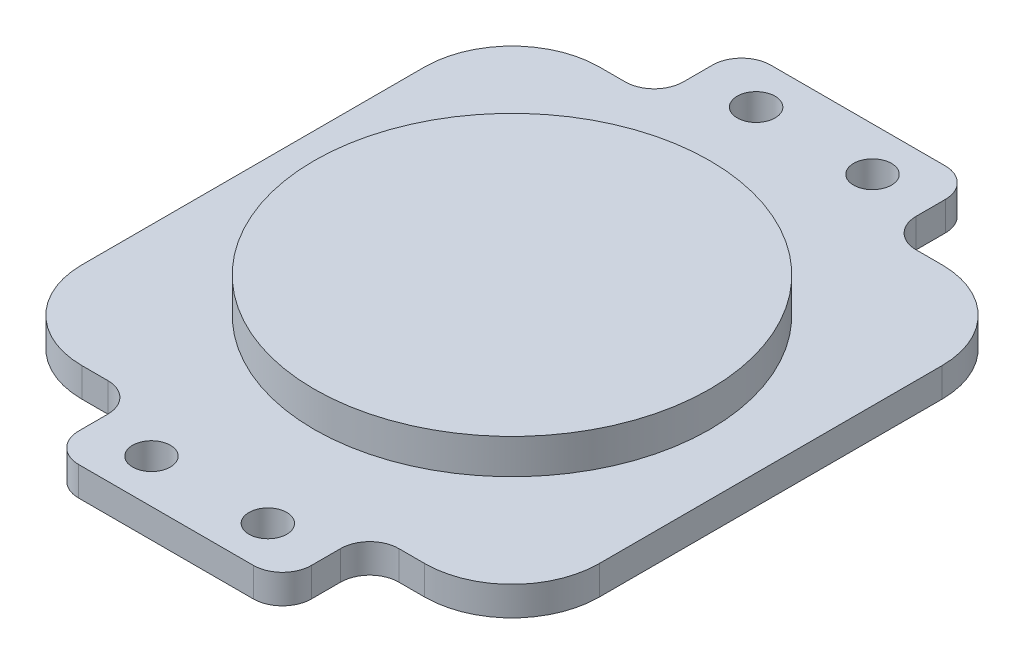
ISO-10303-21;
HEADER;
FILE_DESCRIPTION(('STEP AP214'),'2;1');
FILE_NAME('part.step','',(''),(''),'','','');
FILE_SCHEMA(('AUTOMOTIVE_DESIGN { 1 0 10303 214 1 1 1 1 }'));
ENDSEC;
DATA;
#1=APPLICATION_CONTEXT('core data for automotive mechanical design processes');
#2=APPLICATION_PROTOCOL_DEFINITION('international standard','automotive_design',2000,#1);
#3=PRODUCT_CONTEXT('',#1,'mechanical');
#4=PRODUCT('Part','Part','',(#3));
#5=PRODUCT_RELATED_PRODUCT_CATEGORY('part','',(#4));
#6=PRODUCT_DEFINITION_FORMATION('','',#4);
#7=PRODUCT_DEFINITION_CONTEXT('part definition',#1,'design');
#8=PRODUCT_DEFINITION('design','',#6,#7);
#9=PRODUCT_DEFINITION_SHAPE('','',#8);
#10=(LENGTH_UNIT() NAMED_UNIT(*) SI_UNIT(.MILLI.,.METRE.));
#11=(NAMED_UNIT(*) PLANE_ANGLE_UNIT() SI_UNIT($,.RADIAN.));
#12=(NAMED_UNIT(*) SI_UNIT($,.STERADIAN.) SOLID_ANGLE_UNIT());
#13=UNCERTAINTY_MEASURE_WITH_UNIT(LENGTH_MEASURE(1.E-05),#10,'distance_accuracy_value','');
#14=(GEOMETRIC_REPRESENTATION_CONTEXT(3) GLOBAL_UNCERTAINTY_ASSIGNED_CONTEXT((#13)) GLOBAL_UNIT_ASSIGNED_CONTEXT((#10,
#11,#12)) REPRESENTATION_CONTEXT('',''));
#15=CARTESIAN_POINT('',(0.,0.,0.));
#16=DIRECTION('',(0.,0.,1.));
#17=DIRECTION('',(1.,0.,0.));
#18=AXIS2_PLACEMENT_3D('',#15,#16,#17);
#19=CARTESIAN_POINT('',(-44.45,5.,-44.45));
#20=DIRECTION('',(0.,0.,1.));
#21=DIRECTION('',(1.,0.,0.));
#22=AXIS2_PLACEMENT_3D('',#19,#20,#21);
#23=PLANE('',#22);
#24=DIRECTION('',(-1.,0.,0.));
#25=VECTOR('',#24,1.);
#26=CARTESIAN_POINT('',(-44.45,0.,-44.45));
#27=LINE('',#26,#25);
#28=CARTESIAN_POINT('',(29.45,0.,-44.45));
#29=VERTEX_POINT('',#28);
#30=CARTESIAN_POINT('',(25.,0.,-44.45));
#31=VERTEX_POINT('',#30);
#32=EDGE_CURVE('E425',#29,#31,#27,.T.);
#33=ORIENTED_EDGE('',*,*,#32,.T.);
#34=DIRECTION('',(0.,-1.,0.));
#35=VECTOR('',#34,1.);
#36=CARTESIAN_POINT('',(25.,5.,-44.45));
#37=LINE('',#36,#35);
#38=CARTESIAN_POINT('',(25.,5.,-44.45));
#39=VERTEX_POINT('',#38);
#40=EDGE_CURVE('E297',#31,#39,#37,.F.);
#41=ORIENTED_EDGE('',*,*,#40,.T.);
#42=DIRECTION('',(-1.,0.,0.));
#43=VECTOR('',#42,1.);
#44=CARTESIAN_POINT('',(-44.45,5.,-44.45));
#45=LINE('',#44,#43);
#46=CARTESIAN_POINT('',(29.45,5.,-44.45));
#47=VERTEX_POINT('',#46);
#48=EDGE_CURVE('E415',#47,#39,#45,.T.);
#49=ORIENTED_EDGE('',*,*,#48,.F.);
#50=DIRECTION('',(0.,-1.,0.));
#51=VECTOR('',#50,1.);
#52=CARTESIAN_POINT('',(29.45,5.,-44.45));
#53=LINE('',#52,#51);
#54=EDGE_CURVE('E282',#47,#29,#53,.T.);
#55=ORIENTED_EDGE('',*,*,#54,.T.);
#56=EDGE_LOOP('',(#33,#41,#49,#55));
#57=FACE_BOUND('',#56,.T.);
#58=ADVANCED_FACE('F44',(#57),#23,.F.);
#59=CARTESIAN_POINT('',(-44.45,5.,44.45));
#60=DIRECTION('',(0.,0.,-1.));
#61=DIRECTION('',(-1.,0.,0.));
#62=AXIS2_PLACEMENT_3D('',#59,#60,#61);
#63=PLANE('',#62);
#64=DIRECTION('',(1.,0.,0.));
#65=VECTOR('',#64,1.);
#66=CARTESIAN_POINT('',(-44.45,0.,44.45));
#67=LINE('',#66,#65);
#68=CARTESIAN_POINT('',(-29.45,0.,44.45));
#69=VERTEX_POINT('',#68);
#70=CARTESIAN_POINT('',(-25.,0.,44.45));
#71=VERTEX_POINT('',#70);
#72=EDGE_CURVE('E246',#69,#71,#67,.T.);
#73=ORIENTED_EDGE('',*,*,#72,.T.);
#74=DIRECTION('',(0.,-1.,0.));
#75=VECTOR('',#74,1.);
#76=CARTESIAN_POINT('',(-25.,5.,44.45));
#77=LINE('',#76,#75);
#78=CARTESIAN_POINT('',(-25.,5.,44.45));
#79=VERTEX_POINT('',#78);
#80=EDGE_CURVE('E228',#71,#79,#77,.F.);
#81=ORIENTED_EDGE('',*,*,#80,.T.);
#82=DIRECTION('',(1.,0.,0.));
#83=VECTOR('',#82,1.);
#84=CARTESIAN_POINT('',(-44.45,5.,44.45));
#85=LINE('',#84,#83);
#86=CARTESIAN_POINT('',(-29.45,5.,44.45));
#87=VERTEX_POINT('',#86);
#88=EDGE_CURVE('E210',#87,#79,#85,.T.);
#89=ORIENTED_EDGE('',*,*,#88,.F.);
#90=DIRECTION('',(0.,-1.,0.));
#91=VECTOR('',#90,1.);
#92=CARTESIAN_POINT('',(-29.45,5.,44.45));
#93=LINE('',#92,#91);
#94=EDGE_CURVE('E225',#87,#69,#93,.T.);
#95=ORIENTED_EDGE('',*,*,#94,.T.);
#96=EDGE_LOOP('',(#73,#81,#89,#95));
#97=FACE_BOUND('',#96,.T.);
#98=ADVANCED_FACE('F224',(#97),#63,.F.);
#99=CARTESIAN_POINT('',(44.45,5.,44.45));
#100=DIRECTION('',(-1.,0.,0.));
#101=DIRECTION('',(0.,0.,1.));
#102=AXIS2_PLACEMENT_3D('',#99,#100,#101);
#103=PLANE('',#102);
#104=DIRECTION('',(0.,0.,-1.));
#105=VECTOR('',#104,1.);
#106=CARTESIAN_POINT('',(44.45,5.,44.45));
#107=LINE('',#106,#105);
#108=CARTESIAN_POINT('',(44.45,5.,29.45));
#109=VERTEX_POINT('',#108);
#110=CARTESIAN_POINT('',(44.45,5.,-29.45));
#111=VERTEX_POINT('',#110);
#112=EDGE_CURVE('E435',#109,#111,#107,.T.);
#113=ORIENTED_EDGE('',*,*,#112,.F.);
#114=DIRECTION('',(0.,-1.,0.));
#115=VECTOR('',#114,1.);
#116=CARTESIAN_POINT('',(44.45,5.,29.45));
#117=LINE('',#116,#115);
#118=CARTESIAN_POINT('',(44.45,0.,29.45));
#119=VERTEX_POINT('',#118);
#120=EDGE_CURVE('E274',#109,#119,#117,.T.);
#121=ORIENTED_EDGE('',*,*,#120,.T.);
#122=DIRECTION('',(0.,0.,-1.));
#123=VECTOR('',#122,1.);
#124=CARTESIAN_POINT('',(44.45,0.,44.45));
#125=LINE('',#124,#123);
#126=CARTESIAN_POINT('',(44.45,0.,-29.45));
#127=VERTEX_POINT('',#126);
#128=EDGE_CURVE('E419',#119,#127,#125,.T.);
#129=ORIENTED_EDGE('',*,*,#128,.T.);
#130=DIRECTION('',(0.,-1.,0.));
#131=VECTOR('',#130,1.);
#132=CARTESIAN_POINT('',(44.45,5.,-29.45));
#133=LINE('',#132,#131);
#134=EDGE_CURVE('E218',#127,#111,#133,.F.);
#135=ORIENTED_EDGE('',*,*,#134,.T.);
#136=EDGE_LOOP('',(#113,#121,#129,#135));
#137=FACE_BOUND('',#136,.T.);
#138=ADVANCED_FACE('F536',(#137),#103,.F.);
#139=CARTESIAN_POINT('',(-25.,5.,-44.45));
#140=VERTEX_POINT('',#139);
#141=CARTESIAN_POINT('',(-29.45,5.,-44.45));
#142=VERTEX_POINT('',#141);
#143=EDGE_CURVE('E438',#140,#142,#45,.T.);
#144=ORIENTED_EDGE('',*,*,#143,.F.);
#145=DIRECTION('',(0.,-1.,0.));
#146=VECTOR('',#145,1.);
#147=CARTESIAN_POINT('',(-25.,5.,-44.45));
#148=LINE('',#147,#146);
#149=CARTESIAN_POINT('',(-25.,0.,-44.45));
#150=VERTEX_POINT('',#149);
#151=EDGE_CURVE('E337',#140,#150,#148,.T.);
#152=ORIENTED_EDGE('',*,*,#151,.T.);
#153=CARTESIAN_POINT('',(-29.45,0.,-44.45));
#154=VERTEX_POINT('',#153);
#155=EDGE_CURVE('E423',#150,#154,#27,.T.);
#156=ORIENTED_EDGE('',*,*,#155,.T.);
#157=DIRECTION('',(0.,-1.,0.));
#158=VECTOR('',#157,1.);
#159=CARTESIAN_POINT('',(-29.45,5.,-44.45));
#160=LINE('',#159,#158);
#161=EDGE_CURVE('E286',#154,#142,#160,.F.);
#162=ORIENTED_EDGE('',*,*,#161,.T.);
#163=EDGE_LOOP('',(#144,#152,#156,#162));
#164=FACE_BOUND('',#163,.T.);
#165=ADVANCED_FACE('F531',(#164),#23,.F.);
#166=CARTESIAN_POINT('',(-44.45,5.,44.45));
#167=DIRECTION('',(1.,0.,0.));
#168=DIRECTION('',(0.,0.,-1.));
#169=AXIS2_PLACEMENT_3D('',#166,#167,#168);
#170=PLANE('',#169);
#171=DIRECTION('',(0.,0.,1.));
#172=VECTOR('',#171,1.);
#173=CARTESIAN_POINT('',(-44.45,0.,44.45));
#174=LINE('',#173,#172);
#175=CARTESIAN_POINT('',(-44.45,0.,-29.45));
#176=VERTEX_POINT('',#175);
#177=CARTESIAN_POINT('',(-44.45,0.,29.45));
#178=VERTEX_POINT('',#177);
#179=EDGE_CURVE('E428',#176,#178,#174,.T.);
#180=ORIENTED_EDGE('',*,*,#179,.T.);
#181=DIRECTION('',(0.,-1.,0.));
#182=VECTOR('',#181,1.);
#183=CARTESIAN_POINT('',(-44.45,5.,29.45));
#184=LINE('',#183,#182);
#185=CARTESIAN_POINT('',(-44.45,5.,29.45));
#186=VERTEX_POINT('',#185);
#187=EDGE_CURVE('E261',#178,#186,#184,.F.);
#188=ORIENTED_EDGE('',*,*,#187,.T.);
#189=DIRECTION('',(0.,0.,1.));
#190=VECTOR('',#189,1.);
#191=CARTESIAN_POINT('',(-44.45,5.,44.45));
#192=LINE('',#191,#190);
#193=CARTESIAN_POINT('',(-44.45,5.,-29.45));
#194=VERTEX_POINT('',#193);
#195=EDGE_CURVE('E213',#194,#186,#192,.T.);
#196=ORIENTED_EDGE('',*,*,#195,.F.);
#197=DIRECTION('',(0.,-1.,0.));
#198=VECTOR('',#197,1.);
#199=CARTESIAN_POINT('',(-44.45,5.,-29.45));
#200=LINE('',#199,#198);
#201=EDGE_CURVE('E257',#194,#176,#200,.T.);
#202=ORIENTED_EDGE('',*,*,#201,.T.);
#203=EDGE_LOOP('',(#180,#188,#196,#202));
#204=FACE_BOUND('',#203,.T.);
#205=ADVANCED_FACE('F541',(#204),#170,.F.);
#206=CARTESIAN_POINT('',(25.,5.,44.45));
#207=VERTEX_POINT('',#206);
#208=CARTESIAN_POINT('',(29.45,5.,44.45));
#209=VERTEX_POINT('',#208);
#210=EDGE_CURVE('E231',#207,#209,#85,.T.);
#211=ORIENTED_EDGE('',*,*,#210,.F.);
#212=DIRECTION('',(0.,-1.,0.));
#213=VECTOR('',#212,1.);
#214=CARTESIAN_POINT('',(25.,5.,44.45));
#215=LINE('',#214,#213);
#216=CARTESIAN_POINT('',(25.,0.,44.45));
#217=VERTEX_POINT('',#216);
#218=EDGE_CURVE('E350',#207,#217,#215,.T.);
#219=ORIENTED_EDGE('',*,*,#218,.T.);
#220=CARTESIAN_POINT('',(29.45,0.,44.45));
#221=VERTEX_POINT('',#220);
#222=EDGE_CURVE('E392',#217,#221,#67,.T.);
#223=ORIENTED_EDGE('',*,*,#222,.T.);
#224=DIRECTION('',(0.,-1.,0.));
#225=VECTOR('',#224,1.);
#226=CARTESIAN_POINT('',(29.45,5.,44.45));
#227=LINE('',#226,#225);
#228=EDGE_CURVE('E278',#221,#209,#227,.F.);
#229=ORIENTED_EDGE('',*,*,#228,.T.);
#230=EDGE_LOOP('',(#211,#219,#223,#229));
#231=FACE_BOUND('',#230,.T.);
#232=ADVANCED_FACE('F410',(#231),#63,.F.);
#233=CARTESIAN_POINT('',(0.,5.,0.));
#234=DIRECTION('',(0.,-1.,0.));
#235=DIRECTION('',(0.,0.,-1.));
#236=AXIS2_PLACEMENT_3D('',#233,#234,#235);
#237=PLANE('',#236);
#238=CARTESIAN_POINT('',(-10.,5.,51.95));
#239=DIRECTION('',(0.,-1.,0.));
#240=DIRECTION('',(0.,0.,-1.));
#241=AXIS2_PLACEMENT_3D('',#238,#239,#240);
#242=CIRCLE('',#241,3.25);
#243=CARTESIAN_POINT('',(-10.,5.,48.7));
#244=VERTEX_POINT('',#243);
#245=EDGE_CURVE('E797',#244,#244,#242,.T.);
#246=ORIENTED_EDGE('',*,*,#245,.T.);
#247=EDGE_LOOP('',(#246));
#248=FACE_BOUND('',#247,.T.);
#249=CARTESIAN_POINT('',(10.,5.,-51.95));
#250=DIRECTION('',(0.,-1.,0.));
#251=DIRECTION('',(0.,0.,-1.));
#252=AXIS2_PLACEMENT_3D('',#249,#250,#251);
#253=CIRCLE('',#252,3.25);
#254=CARTESIAN_POINT('',(10.,5.,-55.2));
#255=VERTEX_POINT('',#254);
#256=EDGE_CURVE('E788',#255,#255,#253,.T.);
#257=ORIENTED_EDGE('',*,*,#256,.T.);
#258=EDGE_LOOP('',(#257));
#259=FACE_BOUND('',#258,.T.);
#260=CARTESIAN_POINT('',(-10.,5.,-51.95));
#261=DIRECTION('',(0.,-1.,0.));
#262=DIRECTION('',(0.,0.,-1.));
#263=AXIS2_PLACEMENT_3D('',#260,#261,#262);
#264=CIRCLE('',#263,3.25);
#265=CARTESIAN_POINT('',(-10.,5.,-55.2));
#266=VERTEX_POINT('',#265);
#267=EDGE_CURVE('E804',#266,#266,#264,.T.);
#268=ORIENTED_EDGE('',*,*,#267,.T.);
#269=EDGE_LOOP('',(#268));
#270=FACE_BOUND('',#269,.T.);
#271=CARTESIAN_POINT('',(10.,5.,51.95));
#272=DIRECTION('',(0.,-1.,0.));
#273=DIRECTION('',(0.,0.,-1.));
#274=AXIS2_PLACEMENT_3D('',#271,#272,#273);
#275=CIRCLE('',#274,3.25);
#276=CARTESIAN_POINT('',(10.,5.,48.7));
#277=VERTEX_POINT('',#276);
#278=EDGE_CURVE('E465',#277,#277,#275,.T.);
#279=ORIENTED_EDGE('',*,*,#278,.T.);
#280=EDGE_LOOP('',(#279));
#281=FACE_BOUND('',#280,.T.);
#282=CARTESIAN_POINT('',(0.,5.,0.));
#283=DIRECTION('',(0.,1.,0.));
#284=DIRECTION('',(0.,0.,1.));
#285=AXIS2_PLACEMENT_3D('',#282,#283,#284);
#286=CIRCLE('',#285,34.);
#287=CARTESIAN_POINT('',(0.,5.,34.));
#288=VERTEX_POINT('',#287);
#289=EDGE_CURVE('E230',#288,#288,#286,.T.);
#290=ORIENTED_EDGE('',*,*,#289,.F.);
#291=EDGE_LOOP('',(#290));
#292=FACE_BOUND('',#291,.T.);
#293=DIRECTION('',(0.,0.,-1.));
#294=VECTOR('',#293,1.);
#295=CARTESIAN_POINT('',(20.,5.,0.));
#296=LINE('',#295,#294);
#297=CARTESIAN_POINT('',(20.,5.,-49.45));
#298=VERTEX_POINT('',#297);
#299=CARTESIAN_POINT('',(20.,5.,-54.45));
#300=VERTEX_POINT('',#299);
#301=EDGE_CURVE('E461',#298,#300,#296,.T.);
#302=ORIENTED_EDGE('',*,*,#301,.T.);
#303=CARTESIAN_POINT('',(15.,5.,-54.45));
#304=DIRECTION('',(0.,-1.,0.));
#305=DIRECTION('',(0.,0.,-1.));
#306=AXIS2_PLACEMENT_3D('',#303,#304,#305);
#307=CIRCLE('',#306,5.);
#308=CARTESIAN_POINT('',(15.,5.,-59.45));
#309=VERTEX_POINT('',#308);
#310=EDGE_CURVE('E327',#300,#309,#307,.F.);
#311=ORIENTED_EDGE('',*,*,#310,.T.);
#312=DIRECTION('',(1.,0.,0.));
#313=VECTOR('',#312,1.);
#314=CARTESIAN_POINT('',(0.,5.,-59.45));
#315=LINE('',#314,#313);
#316=CARTESIAN_POINT('',(-15.,5.,-59.45));
#317=VERTEX_POINT('',#316);
#318=EDGE_CURVE('E476',#317,#309,#315,.T.);
#319=ORIENTED_EDGE('',*,*,#318,.F.);
#320=CARTESIAN_POINT('',(-15.,5.,-54.45));
#321=DIRECTION('',(0.,-1.,0.));
#322=DIRECTION('',(0.,0.,-1.));
#323=AXIS2_PLACEMENT_3D('',#320,#321,#322);
#324=CIRCLE('',#323,5.);
#325=CARTESIAN_POINT('',(-20.,5.,-54.45));
#326=VERTEX_POINT('',#325);
#327=EDGE_CURVE('E66',#317,#326,#324,.F.);
#328=ORIENTED_EDGE('',*,*,#327,.T.);
#329=DIRECTION('',(0.,0.,-1.));
#330=VECTOR('',#329,1.);
#331=CARTESIAN_POINT('',(-20.,5.,0.));
#332=LINE('',#331,#330);
#333=CARTESIAN_POINT('',(-20.,5.,-49.45));
#334=VERTEX_POINT('',#333);
#335=EDGE_CURVE('E503',#334,#326,#332,.T.);
#336=ORIENTED_EDGE('',*,*,#335,.F.);
#337=CARTESIAN_POINT('',(-25.,5.,-49.45));
#338=DIRECTION('',(0.,-1.,0.));
#339=DIRECTION('',(0.,0.,-1.));
#340=AXIS2_PLACEMENT_3D('',#337,#338,#339);
#341=CIRCLE('',#340,5.);
#342=EDGE_CURVE('E60',#334,#140,#341,.T.);
#343=ORIENTED_EDGE('',*,*,#342,.T.);
#344=ORIENTED_EDGE('',*,*,#143,.T.);
#345=CARTESIAN_POINT('',(-29.45,5.,-29.45));
#346=DIRECTION('',(0.,-1.,0.));
#347=DIRECTION('',(0.,0.,-1.));
#348=AXIS2_PLACEMENT_3D('',#345,#346,#347);
#349=CIRCLE('',#348,15.);
#350=EDGE_CURVE('E264',#142,#194,#349,.F.);
#351=ORIENTED_EDGE('',*,*,#350,.T.);
#352=ORIENTED_EDGE('',*,*,#195,.T.);
#353=CARTESIAN_POINT('',(-29.45,5.,29.45));
#354=DIRECTION('',(0.,-1.,0.));
#355=DIRECTION('',(0.,0.,-1.));
#356=AXIS2_PLACEMENT_3D('',#353,#354,#355);
#357=CIRCLE('',#356,15.);
#358=EDGE_CURVE('E206',#186,#87,#357,.F.);
#359=ORIENTED_EDGE('',*,*,#358,.T.);
#360=ORIENTED_EDGE('',*,*,#88,.T.);
#361=CARTESIAN_POINT('',(-25.,5.,49.45));
#362=DIRECTION('',(0.,-1.,0.));
#363=DIRECTION('',(0.,0.,-1.));
#364=AXIS2_PLACEMENT_3D('',#361,#362,#363);
#365=CIRCLE('',#364,5.);
#366=CARTESIAN_POINT('',(-20.,5.,49.45));
#367=VERTEX_POINT('',#366);
#368=EDGE_CURVE('E382',#79,#367,#365,.T.);
#369=ORIENTED_EDGE('',*,*,#368,.T.);
#370=DIRECTION('',(0.,0.,1.));
#371=VECTOR('',#370,1.);
#372=CARTESIAN_POINT('',(-20.,5.,0.));
#373=LINE('',#372,#371);
#374=CARTESIAN_POINT('',(-20.,5.,54.45));
#375=VERTEX_POINT('',#374);
#376=EDGE_CURVE('E492',#367,#375,#373,.T.);
#377=ORIENTED_EDGE('',*,*,#376,.T.);
#378=CARTESIAN_POINT('',(-15.,5.,54.45));
#379=DIRECTION('',(0.,-1.,0.));
#380=DIRECTION('',(0.,0.,-1.));
#381=AXIS2_PLACEMENT_3D('',#378,#379,#380);
#382=CIRCLE('',#381,5.);
#383=CARTESIAN_POINT('',(-15.,5.,59.45));
#384=VERTEX_POINT('',#383);
#385=EDGE_CURVE('E322',#375,#384,#382,.F.);
#386=ORIENTED_EDGE('',*,*,#385,.T.);
#387=DIRECTION('',(-1.,0.,0.));
#388=VECTOR('',#387,1.);
#389=CARTESIAN_POINT('',(0.,5.,59.45));
#390=LINE('',#389,#388);
#391=CARTESIAN_POINT('',(15.,5.,59.45));
#392=VERTEX_POINT('',#391);
#393=EDGE_CURVE('E482',#392,#384,#390,.T.);
#394=ORIENTED_EDGE('',*,*,#393,.F.);
#395=CARTESIAN_POINT('',(15.,5.,54.45));
#396=DIRECTION('',(0.,-1.,0.));
#397=DIRECTION('',(0.,0.,-1.));
#398=AXIS2_PLACEMENT_3D('',#395,#396,#397);
#399=CIRCLE('',#398,5.);
#400=CARTESIAN_POINT('',(20.,5.,54.45));
#401=VERTEX_POINT('',#400);
#402=EDGE_CURVE('E319',#392,#401,#399,.F.);
#403=ORIENTED_EDGE('',*,*,#402,.T.);
#404=DIRECTION('',(0.,0.,1.));
#405=VECTOR('',#404,1.);
#406=CARTESIAN_POINT('',(20.,5.,0.));
#407=LINE('',#406,#405);
#408=CARTESIAN_POINT('',(20.,5.,49.45));
#409=VERTEX_POINT('',#408);
#410=EDGE_CURVE('E408',#409,#401,#407,.T.);
#411=ORIENTED_EDGE('',*,*,#410,.F.);
#412=CARTESIAN_POINT('',(25.,5.,49.45));
#413=DIRECTION('',(0.,-1.,0.));
#414=DIRECTION('',(0.,0.,-1.));
#415=AXIS2_PLACEMENT_3D('',#412,#413,#414);
#416=CIRCLE('',#415,5.);
#417=EDGE_CURVE('E11',#409,#207,#416,.T.);
#418=ORIENTED_EDGE('',*,*,#417,.T.);
#419=ORIENTED_EDGE('',*,*,#210,.T.);
#420=CARTESIAN_POINT('',(29.45,5.,29.45));
#421=DIRECTION('',(0.,-1.,0.));
#422=DIRECTION('',(0.,0.,-1.));
#423=AXIS2_PLACEMENT_3D('',#420,#421,#422);
#424=CIRCLE('',#423,15.);
#425=EDGE_CURVE('E219',#209,#109,#424,.F.);
#426=ORIENTED_EDGE('',*,*,#425,.T.);
#427=ORIENTED_EDGE('',*,*,#112,.T.);
#428=CARTESIAN_POINT('',(29.45,5.,-29.45));
#429=DIRECTION('',(0.,-1.,0.));
#430=DIRECTION('',(0.,0.,-1.));
#431=AXIS2_PLACEMENT_3D('',#428,#429,#430);
#432=CIRCLE('',#431,15.);
#433=EDGE_CURVE('E267',#111,#47,#432,.F.);
#434=ORIENTED_EDGE('',*,*,#433,.T.);
#435=ORIENTED_EDGE('',*,*,#48,.T.);
#436=CARTESIAN_POINT('',(25.,5.,-49.45));
#437=DIRECTION('',(0.,-1.,0.));
#438=DIRECTION('',(0.,0.,-1.));
#439=AXIS2_PLACEMENT_3D('',#436,#437,#438);
#440=CIRCLE('',#439,5.);
#441=EDGE_CURVE('E371',#39,#298,#440,.T.);
#442=ORIENTED_EDGE('',*,*,#441,.T.);
#443=EDGE_LOOP('',(#302,#311,#319,#328,#336,#343,#344,#351,#352,#359,#360,#369,#377,#386,#394,
#403,#411,#418,#419,#426,#427,#434,#435,#442));
#444=FACE_BOUND('',#443,.T.);
#445=ADVANCED_FACE('F209',(#248,#259,#270,#281,#292,#444),#237,.F.);
#446=CARTESIAN_POINT('',(0.,0.,0.));
#447=DIRECTION('',(0.,-1.,0.));
#448=DIRECTION('',(0.,0.,-1.));
#449=AXIS2_PLACEMENT_3D('',#446,#447,#448);
#450=PLANE('',#449);
#451=CARTESIAN_POINT('',(-10.,0.,51.95));
#452=DIRECTION('',(0.,-1.,0.));
#453=DIRECTION('',(0.,0.,-1.));
#454=AXIS2_PLACEMENT_3D('',#451,#452,#453);
#455=CIRCLE('',#454,3.25);
#456=CARTESIAN_POINT('',(-10.,0.,48.7));
#457=VERTEX_POINT('',#456);
#458=EDGE_CURVE('E786',#457,#457,#455,.T.);
#459=ORIENTED_EDGE('',*,*,#458,.F.);
#460=EDGE_LOOP('',(#459));
#461=FACE_BOUND('',#460,.T.);
#462=CARTESIAN_POINT('',(10.,0.,-51.95));
#463=DIRECTION('',(0.,-1.,0.));
#464=DIRECTION('',(0.,0.,-1.));
#465=AXIS2_PLACEMENT_3D('',#462,#463,#464);
#466=CIRCLE('',#465,3.25);
#467=CARTESIAN_POINT('',(10.,0.,-55.2));
#468=VERTEX_POINT('',#467);
#469=EDGE_CURVE('E792',#468,#468,#466,.T.);
#470=ORIENTED_EDGE('',*,*,#469,.F.);
#471=EDGE_LOOP('',(#470));
#472=FACE_BOUND('',#471,.T.);
#473=CARTESIAN_POINT('',(-10.,0.,-51.95));
#474=DIRECTION('',(0.,-1.,0.));
#475=DIRECTION('',(0.,0.,-1.));
#476=AXIS2_PLACEMENT_3D('',#473,#474,#475);
#477=CIRCLE('',#476,3.25);
#478=CARTESIAN_POINT('',(-10.,0.,-55.2));
#479=VERTEX_POINT('',#478);
#480=EDGE_CURVE('E793',#479,#479,#477,.T.);
#481=ORIENTED_EDGE('',*,*,#480,.F.);
#482=EDGE_LOOP('',(#481));
#483=FACE_BOUND('',#482,.T.);
#484=CARTESIAN_POINT('',(10.,0.,51.95));
#485=DIRECTION('',(0.,-1.,0.));
#486=DIRECTION('',(0.,0.,-1.));
#487=AXIS2_PLACEMENT_3D('',#484,#485,#486);
#488=CIRCLE('',#487,3.25);
#489=CARTESIAN_POINT('',(10.,0.,48.7));
#490=VERTEX_POINT('',#489);
#491=EDGE_CURVE('E473',#490,#490,#488,.T.);
#492=ORIENTED_EDGE('',*,*,#491,.F.);
#493=EDGE_LOOP('',(#492));
#494=FACE_BOUND('',#493,.T.);
#495=DIRECTION('',(1.,0.,0.));
#496=VECTOR('',#495,1.);
#497=CARTESIAN_POINT('',(0.,0.,-59.45));
#498=LINE('',#497,#496);
#499=CARTESIAN_POINT('',(-15.,0.,-59.45));
#500=VERTEX_POINT('',#499);
#501=CARTESIAN_POINT('',(15.,0.,-59.45));
#502=VERTEX_POINT('',#501);
#503=EDGE_CURVE('E470',#500,#502,#498,.T.);
#504=ORIENTED_EDGE('',*,*,#503,.T.);
#505=CARTESIAN_POINT('',(15.,0.,-54.45));
#506=DIRECTION('',(0.,-1.,0.));
#507=DIRECTION('',(0.,0.,-1.));
#508=AXIS2_PLACEMENT_3D('',#505,#506,#507);
#509=CIRCLE('',#508,5.);
#510=CARTESIAN_POINT('',(20.,0.,-54.45));
#511=VERTEX_POINT('',#510);
#512=EDGE_CURVE('E316',#502,#511,#509,.T.);
#513=ORIENTED_EDGE('',*,*,#512,.T.);
#514=DIRECTION('',(0.,0.,-1.));
#515=VECTOR('',#514,1.);
#516=CARTESIAN_POINT('',(20.,0.,0.));
#517=LINE('',#516,#515);
#518=CARTESIAN_POINT('',(20.,0.,-49.45));
#519=VERTEX_POINT('',#518);
#520=EDGE_CURVE('E459',#519,#511,#517,.T.);
#521=ORIENTED_EDGE('',*,*,#520,.F.);
#522=CARTESIAN_POINT('',(25.,0.,-49.45));
#523=DIRECTION('',(0.,-1.,0.));
#524=DIRECTION('',(0.,0.,-1.));
#525=AXIS2_PLACEMENT_3D('',#522,#523,#524);
#526=CIRCLE('',#525,5.);
#527=EDGE_CURVE('E368',#519,#31,#526,.F.);
#528=ORIENTED_EDGE('',*,*,#527,.T.);
#529=ORIENTED_EDGE('',*,*,#32,.F.);
#530=CARTESIAN_POINT('',(29.45,0.,-29.45));
#531=DIRECTION('',(0.,-1.,0.));
#532=DIRECTION('',(0.,0.,-1.));
#533=AXIS2_PLACEMENT_3D('',#530,#531,#532);
#534=CIRCLE('',#533,15.);
#535=EDGE_CURVE('E241',#29,#127,#534,.T.);
#536=ORIENTED_EDGE('',*,*,#535,.T.);
#537=ORIENTED_EDGE('',*,*,#128,.F.);
#538=CARTESIAN_POINT('',(29.45,0.,29.45));
#539=DIRECTION('',(0.,-1.,0.));
#540=DIRECTION('',(0.,0.,-1.));
#541=AXIS2_PLACEMENT_3D('',#538,#539,#540);
#542=CIRCLE('',#541,15.);
#543=EDGE_CURVE('E251',#119,#221,#542,.T.);
#544=ORIENTED_EDGE('',*,*,#543,.T.);
#545=ORIENTED_EDGE('',*,*,#222,.F.);
#546=CARTESIAN_POINT('',(25.,0.,49.45));
#547=DIRECTION('',(0.,-1.,0.));
#548=DIRECTION('',(0.,0.,-1.));
#549=AXIS2_PLACEMENT_3D('',#546,#547,#548);
#550=CIRCLE('',#549,5.);
#551=CARTESIAN_POINT('',(20.,0.,49.45));
#552=VERTEX_POINT('',#551);
#553=EDGE_CURVE('E53',#217,#552,#550,.F.);
#554=ORIENTED_EDGE('',*,*,#553,.T.);
#555=DIRECTION('',(0.,0.,1.));
#556=VECTOR('',#555,1.);
#557=CARTESIAN_POINT('',(20.,0.,0.));
#558=LINE('',#557,#556);
#559=CARTESIAN_POINT('',(20.,0.,54.45));
#560=VERTEX_POINT('',#559);
#561=EDGE_CURVE('E391',#552,#560,#558,.T.);
#562=ORIENTED_EDGE('',*,*,#561,.T.);
#563=CARTESIAN_POINT('',(15.,0.,54.45));
#564=DIRECTION('',(0.,-1.,0.));
#565=DIRECTION('',(0.,0.,-1.));
#566=AXIS2_PLACEMENT_3D('',#563,#564,#565);
#567=CIRCLE('',#566,5.);
#568=CARTESIAN_POINT('',(15.,0.,59.45));
#569=VERTEX_POINT('',#568);
#570=EDGE_CURVE('E307',#560,#569,#567,.T.);
#571=ORIENTED_EDGE('',*,*,#570,.T.);
#572=DIRECTION('',(-1.,0.,0.));
#573=VECTOR('',#572,1.);
#574=CARTESIAN_POINT('',(0.,0.,59.45));
#575=LINE('',#574,#573);
#576=CARTESIAN_POINT('',(-15.,0.,59.45));
#577=VERTEX_POINT('',#576);
#578=EDGE_CURVE('E402',#569,#577,#575,.T.);
#579=ORIENTED_EDGE('',*,*,#578,.T.);
#580=CARTESIAN_POINT('',(-15.,0.,54.45));
#581=DIRECTION('',(0.,-1.,0.));
#582=DIRECTION('',(0.,0.,-1.));
#583=AXIS2_PLACEMENT_3D('',#580,#581,#582);
#584=CIRCLE('',#583,5.);
#585=CARTESIAN_POINT('',(-20.,0.,54.45));
#586=VERTEX_POINT('',#585);
#587=EDGE_CURVE('E310',#577,#586,#584,.T.);
#588=ORIENTED_EDGE('',*,*,#587,.T.);
#589=DIRECTION('',(0.,0.,1.));
#590=VECTOR('',#589,1.);
#591=CARTESIAN_POINT('',(-20.,0.,0.));
#592=LINE('',#591,#590);
#593=CARTESIAN_POINT('',(-20.,0.,49.45));
#594=VERTEX_POINT('',#593);
#595=EDGE_CURVE('E403',#594,#586,#592,.T.);
#596=ORIENTED_EDGE('',*,*,#595,.F.);
#597=CARTESIAN_POINT('',(-25.,0.,49.45));
#598=DIRECTION('',(0.,-1.,0.));
#599=DIRECTION('',(0.,0.,-1.));
#600=AXIS2_PLACEMENT_3D('',#597,#598,#599);
#601=CIRCLE('',#600,5.);
#602=EDGE_CURVE('E379',#594,#71,#601,.F.);
#603=ORIENTED_EDGE('',*,*,#602,.T.);
#604=ORIENTED_EDGE('',*,*,#72,.F.);
#605=CARTESIAN_POINT('',(-29.45,0.,29.45));
#606=DIRECTION('',(0.,-1.,0.));
#607=DIRECTION('',(0.,0.,-1.));
#608=AXIS2_PLACEMENT_3D('',#605,#606,#607);
#609=CIRCLE('',#608,15.);
#610=EDGE_CURVE('E234',#69,#178,#609,.T.);
#611=ORIENTED_EDGE('',*,*,#610,.T.);
#612=ORIENTED_EDGE('',*,*,#179,.F.);
#613=CARTESIAN_POINT('',(-29.45,0.,-29.45));
#614=DIRECTION('',(0.,-1.,0.));
#615=DIRECTION('',(0.,0.,-1.));
#616=AXIS2_PLACEMENT_3D('',#613,#614,#615);
#617=CIRCLE('',#616,15.);
#618=EDGE_CURVE('E236',#176,#154,#617,.T.);
#619=ORIENTED_EDGE('',*,*,#618,.T.);
#620=ORIENTED_EDGE('',*,*,#155,.F.);
#621=CARTESIAN_POINT('',(-25.,0.,-49.45));
#622=DIRECTION('',(0.,-1.,0.));
#623=DIRECTION('',(0.,0.,-1.));
#624=AXIS2_PLACEMENT_3D('',#621,#622,#623);
#625=CIRCLE('',#624,5.);
#626=CARTESIAN_POINT('',(-20.,0.,-49.45));
#627=VERTEX_POINT('',#626);
#628=EDGE_CURVE('E374',#150,#627,#625,.F.);
#629=ORIENTED_EDGE('',*,*,#628,.T.);
#630=DIRECTION('',(0.,0.,-1.));
#631=VECTOR('',#630,1.);
#632=CARTESIAN_POINT('',(-20.,0.,0.));
#633=LINE('',#632,#631);
#634=CARTESIAN_POINT('',(-20.,0.,-54.45));
#635=VERTEX_POINT('',#634);
#636=EDGE_CURVE('E464',#627,#635,#633,.T.);
#637=ORIENTED_EDGE('',*,*,#636,.T.);
#638=CARTESIAN_POINT('',(-15.,0.,-54.45));
#639=DIRECTION('',(0.,-1.,0.));
#640=DIRECTION('',(0.,0.,-1.));
#641=AXIS2_PLACEMENT_3D('',#638,#639,#640);
#642=CIRCLE('',#641,5.);
#643=EDGE_CURVE('E313',#635,#500,#642,.T.);
#644=ORIENTED_EDGE('',*,*,#643,.T.);
#645=EDGE_LOOP('',(#504,#513,#521,#528,#529,#536,#537,#544,#545,#554,#562,#571,#579,#588,#596,
#603,#604,#611,#612,#619,#620,#629,#637,#644));
#646=FACE_BOUND('',#645,.T.);
#647=ADVANCED_FACE('F390',(#461,#472,#483,#494,#646),#450,.T.);
#648=CARTESIAN_POINT('',(0.,11.,0.));
#649=DIRECTION('',(0.,-1.,0.));
#650=DIRECTION('',(0.,0.,-1.));
#651=AXIS2_PLACEMENT_3D('',#648,#649,#650);
#652=CYLINDRICAL_SURFACE('',#651,34.);
#653=CARTESIAN_POINT('',(0.,11.,0.));
#654=DIRECTION('',(0.,1.,0.));
#655=DIRECTION('',(0.,0.,1.));
#656=AXIS2_PLACEMENT_3D('',#653,#654,#655);
#657=CIRCLE('',#656,34.);
#658=CARTESIAN_POINT('',(0.,11.,34.));
#659=VERTEX_POINT('',#658);
#660=EDGE_CURVE('E424',#659,#659,#657,.T.);
#661=ORIENTED_EDGE('',*,*,#660,.F.);
#662=EDGE_LOOP('',(#661));
#663=FACE_BOUND('',#662,.T.);
#664=ORIENTED_EDGE('',*,*,#289,.T.);
#665=EDGE_LOOP('',(#664));
#666=FACE_BOUND('',#665,.T.);
#667=ADVANCED_FACE('F576',(#663,#666),#652,.T.);
#668=CARTESIAN_POINT('',(0.,11.,0.));
#669=DIRECTION('',(0.,1.,0.));
#670=DIRECTION('',(0.,0.,1.));
#671=AXIS2_PLACEMENT_3D('',#668,#669,#670);
#672=PLANE('',#671);
#673=ORIENTED_EDGE('',*,*,#660,.T.);
#674=EDGE_LOOP('',(#673));
#675=FACE_BOUND('',#674,.T.);
#676=ADVANCED_FACE('F572',(#675),#672,.T.);
#677=CARTESIAN_POINT('',(-20.,5.,0.));
#678=DIRECTION('',(1.,0.,0.));
#679=DIRECTION('',(0.,0.,-1.));
#680=AXIS2_PLACEMENT_3D('',#677,#678,#679);
#681=PLANE('',#680);
#682=ORIENTED_EDGE('',*,*,#376,.F.);
#683=DIRECTION('',(0.,-1.,0.));
#684=VECTOR('',#683,1.);
#685=CARTESIAN_POINT('',(-20.,0.,49.45));
#686=LINE('',#685,#684);
#687=EDGE_CURVE('E344',#367,#594,#686,.T.);
#688=ORIENTED_EDGE('',*,*,#687,.T.);
#689=ORIENTED_EDGE('',*,*,#595,.T.);
#690=DIRECTION('',(0.,-1.,0.));
#691=VECTOR('',#690,1.);
#692=CARTESIAN_POINT('',(-20.,5.,54.45));
#693=LINE('',#692,#691);
#694=EDGE_CURVE('E341',#586,#375,#693,.F.);
#695=ORIENTED_EDGE('',*,*,#694,.T.);
#696=EDGE_LOOP('',(#682,#688,#689,#695));
#697=FACE_BOUND('',#696,.T.);
#698=ADVANCED_FACE('F575',(#697),#681,.F.);
#699=CARTESIAN_POINT('',(0.,5.,59.45));
#700=DIRECTION('',(0.,0.,1.));
#701=DIRECTION('',(1.,0.,0.));
#702=AXIS2_PLACEMENT_3D('',#699,#700,#701);
#703=PLANE('',#702);
#704=ORIENTED_EDGE('',*,*,#393,.T.);
#705=DIRECTION('',(0.,-1.,0.));
#706=VECTOR('',#705,1.);
#707=CARTESIAN_POINT('',(-15.,0.,59.45));
#708=LINE('',#707,#706);
#709=EDGE_CURVE('E364',#384,#577,#708,.T.);
#710=ORIENTED_EDGE('',*,*,#709,.T.);
#711=ORIENTED_EDGE('',*,*,#578,.F.);
#712=DIRECTION('',(0.,-1.,0.));
#713=VECTOR('',#712,1.);
#714=CARTESIAN_POINT('',(15.,5.,59.45));
#715=LINE('',#714,#713);
#716=EDGE_CURVE('E361',#569,#392,#715,.F.);
#717=ORIENTED_EDGE('',*,*,#716,.T.);
#718=EDGE_LOOP('',(#704,#710,#711,#717));
#719=FACE_BOUND('',#718,.T.);
#720=ADVANCED_FACE('F607',(#719),#703,.T.);
#721=CARTESIAN_POINT('',(20.,5.,0.));
#722=DIRECTION('',(1.,0.,0.));
#723=DIRECTION('',(0.,0.,-1.));
#724=AXIS2_PLACEMENT_3D('',#721,#722,#723);
#725=PLANE('',#724);
#726=ORIENTED_EDGE('',*,*,#561,.F.);
#727=DIRECTION('',(0.,-1.,0.));
#728=VECTOR('',#727,1.);
#729=CARTESIAN_POINT('',(20.,5.,49.45));
#730=LINE('',#729,#728);
#731=EDGE_CURVE('E358',#552,#409,#730,.F.);
#732=ORIENTED_EDGE('',*,*,#731,.T.);
#733=ORIENTED_EDGE('',*,*,#410,.T.);
#734=DIRECTION('',(0.,-1.,0.));
#735=VECTOR('',#734,1.);
#736=CARTESIAN_POINT('',(20.,5.,54.45));
#737=LINE('',#736,#735);
#738=EDGE_CURVE('E354',#401,#560,#737,.T.);
#739=ORIENTED_EDGE('',*,*,#738,.T.);
#740=EDGE_LOOP('',(#726,#732,#733,#739));
#741=FACE_BOUND('',#740,.T.);
#742=ADVANCED_FACE('F397',(#741),#725,.T.);
#743=CARTESIAN_POINT('',(20.,5.,0.));
#744=DIRECTION('',(-1.,0.,0.));
#745=DIRECTION('',(0.,0.,1.));
#746=AXIS2_PLACEMENT_3D('',#743,#744,#745);
#747=PLANE('',#746);
#748=ORIENTED_EDGE('',*,*,#301,.F.);
#749=DIRECTION('',(0.,-1.,0.));
#750=VECTOR('',#749,1.);
#751=CARTESIAN_POINT('',(20.,0.,-49.45));
#752=LINE('',#751,#750);
#753=EDGE_CURVE('E293',#298,#519,#752,.T.);
#754=ORIENTED_EDGE('',*,*,#753,.T.);
#755=ORIENTED_EDGE('',*,*,#520,.T.);
#756=DIRECTION('',(0.,-1.,0.));
#757=VECTOR('',#756,1.);
#758=CARTESIAN_POINT('',(20.,5.,-54.45));
#759=LINE('',#758,#757);
#760=EDGE_CURVE('E290',#511,#300,#759,.F.);
#761=ORIENTED_EDGE('',*,*,#760,.T.);
#762=EDGE_LOOP('',(#748,#754,#755,#761));
#763=FACE_BOUND('',#762,.T.);
#764=ADVANCED_FACE('F458',(#763),#747,.F.);
#765=CARTESIAN_POINT('',(0.,5.,-59.45));
#766=DIRECTION('',(0.,0.,-1.));
#767=DIRECTION('',(-1.,0.,0.));
#768=AXIS2_PLACEMENT_3D('',#765,#766,#767);
#769=PLANE('',#768);
#770=ORIENTED_EDGE('',*,*,#318,.T.);
#771=DIRECTION('',(0.,-1.,0.));
#772=VECTOR('',#771,1.);
#773=CARTESIAN_POINT('',(15.,0.,-59.45));
#774=LINE('',#773,#772);
#775=EDGE_CURVE('E303',#309,#502,#774,.T.);
#776=ORIENTED_EDGE('',*,*,#775,.T.);
#777=ORIENTED_EDGE('',*,*,#503,.F.);
#778=DIRECTION('',(0.,-1.,0.));
#779=VECTOR('',#778,1.);
#780=CARTESIAN_POINT('',(-15.,5.,-59.45));
#781=LINE('',#780,#779);
#782=EDGE_CURVE('E300',#500,#317,#781,.F.);
#783=ORIENTED_EDGE('',*,*,#782,.T.);
#784=EDGE_LOOP('',(#770,#776,#777,#783));
#785=FACE_BOUND('',#784,.T.);
#786=ADVANCED_FACE('F511',(#785),#769,.T.);
#787=CARTESIAN_POINT('',(-20.,5.,0.));
#788=DIRECTION('',(-1.,0.,0.));
#789=DIRECTION('',(0.,0.,1.));
#790=AXIS2_PLACEMENT_3D('',#787,#788,#789);
#791=PLANE('',#790);
#792=ORIENTED_EDGE('',*,*,#335,.T.);
#793=DIRECTION('',(0.,-1.,0.));
#794=VECTOR('',#793,1.);
#795=CARTESIAN_POINT('',(-20.,5.,-54.45));
#796=LINE('',#795,#794);
#797=EDGE_CURVE('E333',#326,#635,#796,.T.);
#798=ORIENTED_EDGE('',*,*,#797,.T.);
#799=ORIENTED_EDGE('',*,*,#636,.F.);
#800=DIRECTION('',(0.,-1.,0.));
#801=VECTOR('',#800,1.);
#802=CARTESIAN_POINT('',(-20.,5.,-49.45));
#803=LINE('',#802,#801);
#804=EDGE_CURVE('E330',#627,#334,#803,.F.);
#805=ORIENTED_EDGE('',*,*,#804,.T.);
#806=EDGE_LOOP('',(#792,#798,#799,#805));
#807=FACE_BOUND('',#806,.T.);
#808=ADVANCED_FACE('F556',(#807),#791,.T.);
#809=CARTESIAN_POINT('',(10.,5.,51.95));
#810=DIRECTION('',(0.,-1.,0.));
#811=DIRECTION('',(0.,0.,-1.));
#812=AXIS2_PLACEMENT_3D('',#809,#810,#811);
#813=CYLINDRICAL_SURFACE('',#812,3.25);
#814=ORIENTED_EDGE('',*,*,#278,.F.);
#815=EDGE_LOOP('',(#814));
#816=FACE_BOUND('',#815,.T.);
#817=ORIENTED_EDGE('',*,*,#491,.T.);
#818=EDGE_LOOP('',(#817));
#819=FACE_BOUND('',#818,.T.);
#820=ADVANCED_FACE('F558',(#816,#819),#813,.F.);
#821=CARTESIAN_POINT('',(-10.,5.,-51.95));
#822=DIRECTION('',(0.,-1.,0.));
#823=DIRECTION('',(0.,0.,-1.));
#824=AXIS2_PLACEMENT_3D('',#821,#822,#823);
#825=CYLINDRICAL_SURFACE('',#824,3.25);
#826=ORIENTED_EDGE('',*,*,#267,.F.);
#827=EDGE_LOOP('',(#826));
#828=FACE_BOUND('',#827,.T.);
#829=ORIENTED_EDGE('',*,*,#480,.T.);
#830=EDGE_LOOP('',(#829));
#831=FACE_BOUND('',#830,.T.);
#832=ADVANCED_FACE('F564',(#828,#831),#825,.F.);
#833=CARTESIAN_POINT('',(10.,5.,-51.95));
#834=DIRECTION('',(0.,-1.,0.));
#835=DIRECTION('',(0.,0.,-1.));
#836=AXIS2_PLACEMENT_3D('',#833,#834,#835);
#837=CYLINDRICAL_SURFACE('',#836,3.25);
#838=ORIENTED_EDGE('',*,*,#256,.F.);
#839=EDGE_LOOP('',(#838));
#840=FACE_BOUND('',#839,.T.);
#841=ORIENTED_EDGE('',*,*,#469,.T.);
#842=EDGE_LOOP('',(#841));
#843=FACE_BOUND('',#842,.T.);
#844=ADVANCED_FACE('F654',(#840,#843),#837,.F.);
#845=CARTESIAN_POINT('',(-10.,5.,51.95));
#846=DIRECTION('',(0.,-1.,0.));
#847=DIRECTION('',(0.,0.,-1.));
#848=AXIS2_PLACEMENT_3D('',#845,#846,#847);
#849=CYLINDRICAL_SURFACE('',#848,3.25);
#850=ORIENTED_EDGE('',*,*,#245,.F.);
#851=EDGE_LOOP('',(#850));
#852=FACE_BOUND('',#851,.T.);
#853=ORIENTED_EDGE('',*,*,#458,.T.);
#854=EDGE_LOOP('',(#853));
#855=FACE_BOUND('',#854,.T.);
#856=ADVANCED_FACE('F664',(#852,#855),#849,.F.);
#857=CARTESIAN_POINT('',(-29.45,5.,29.45));
#858=DIRECTION('',(0.,-1.,0.));
#859=DIRECTION('',(0.,0.,-1.));
#860=AXIS2_PLACEMENT_3D('',#857,#858,#859);
#861=CYLINDRICAL_SURFACE('',#860,15.);
#862=ORIENTED_EDGE('',*,*,#358,.F.);
#863=ORIENTED_EDGE('',*,*,#187,.F.);
#864=ORIENTED_EDGE('',*,*,#610,.F.);
#865=ORIENTED_EDGE('',*,*,#94,.F.);
#866=EDGE_LOOP('',(#862,#863,#864,#865));
#867=FACE_BOUND('',#866,.T.);
#868=ADVANCED_FACE('F233',(#867),#861,.T.);
#869=CARTESIAN_POINT('',(29.45,5.,29.45));
#870=DIRECTION('',(0.,-1.,0.));
#871=DIRECTION('',(0.,0.,-1.));
#872=AXIS2_PLACEMENT_3D('',#869,#870,#871);
#873=CYLINDRICAL_SURFACE('',#872,15.);
#874=ORIENTED_EDGE('',*,*,#425,.F.);
#875=ORIENTED_EDGE('',*,*,#228,.F.);
#876=ORIENTED_EDGE('',*,*,#543,.F.);
#877=ORIENTED_EDGE('',*,*,#120,.F.);
#878=EDGE_LOOP('',(#874,#875,#876,#877));
#879=FACE_BOUND('',#878,.T.);
#880=ADVANCED_FACE('F683',(#879),#873,.T.);
#881=CARTESIAN_POINT('',(29.45,5.,-29.45));
#882=DIRECTION('',(0.,-1.,0.));
#883=DIRECTION('',(0.,0.,-1.));
#884=AXIS2_PLACEMENT_3D('',#881,#882,#883);
#885=CYLINDRICAL_SURFACE('',#884,15.);
#886=ORIENTED_EDGE('',*,*,#433,.F.);
#887=ORIENTED_EDGE('',*,*,#134,.F.);
#888=ORIENTED_EDGE('',*,*,#535,.F.);
#889=ORIENTED_EDGE('',*,*,#54,.F.);
#890=EDGE_LOOP('',(#886,#887,#888,#889));
#891=FACE_BOUND('',#890,.T.);
#892=ADVANCED_FACE('F692',(#891),#885,.T.);
#893=CARTESIAN_POINT('',(-29.45,5.,-29.45));
#894=DIRECTION('',(0.,-1.,0.));
#895=DIRECTION('',(0.,0.,-1.));
#896=AXIS2_PLACEMENT_3D('',#893,#894,#895);
#897=CYLINDRICAL_SURFACE('',#896,15.);
#898=ORIENTED_EDGE('',*,*,#350,.F.);
#899=ORIENTED_EDGE('',*,*,#161,.F.);
#900=ORIENTED_EDGE('',*,*,#618,.F.);
#901=ORIENTED_EDGE('',*,*,#201,.F.);
#902=EDGE_LOOP('',(#898,#899,#900,#901));
#903=FACE_BOUND('',#902,.T.);
#904=ADVANCED_FACE('F527',(#903),#897,.T.);
#905=CARTESIAN_POINT('',(25.,5.,-49.45));
#906=DIRECTION('',(0.,1.,0.));
#907=DIRECTION('',(0.,0.,1.));
#908=AXIS2_PLACEMENT_3D('',#905,#906,#907);
#909=CYLINDRICAL_SURFACE('',#908,5.);
#910=ORIENTED_EDGE('',*,*,#441,.F.);
#911=ORIENTED_EDGE('',*,*,#40,.F.);
#912=ORIENTED_EDGE('',*,*,#527,.F.);
#913=ORIENTED_EDGE('',*,*,#753,.F.);
#914=EDGE_LOOP('',(#910,#911,#912,#913));
#915=FACE_BOUND('',#914,.T.);
#916=ADVANCED_FACE('F454',(#915),#909,.F.);
#917=CARTESIAN_POINT('',(15.,5.,-54.45));
#918=DIRECTION('',(0.,1.,0.));
#919=DIRECTION('',(0.,0.,1.));
#920=AXIS2_PLACEMENT_3D('',#917,#918,#919);
#921=CYLINDRICAL_SURFACE('',#920,5.);
#922=ORIENTED_EDGE('',*,*,#310,.F.);
#923=ORIENTED_EDGE('',*,*,#760,.F.);
#924=ORIENTED_EDGE('',*,*,#512,.F.);
#925=ORIENTED_EDGE('',*,*,#775,.F.);
#926=EDGE_LOOP('',(#922,#923,#924,#925));
#927=FACE_BOUND('',#926,.T.);
#928=ADVANCED_FACE('F516',(#927),#921,.T.);
#929=CARTESIAN_POINT('',(-15.,5.,-54.45));
#930=DIRECTION('',(0.,-1.,0.));
#931=DIRECTION('',(0.,0.,-1.));
#932=AXIS2_PLACEMENT_3D('',#929,#930,#931);
#933=CYLINDRICAL_SURFACE('',#932,5.);
#934=ORIENTED_EDGE('',*,*,#327,.F.);
#935=ORIENTED_EDGE('',*,*,#782,.F.);
#936=ORIENTED_EDGE('',*,*,#643,.F.);
#937=ORIENTED_EDGE('',*,*,#797,.F.);
#938=EDGE_LOOP('',(#934,#935,#936,#937));
#939=FACE_BOUND('',#938,.T.);
#940=ADVANCED_FACE('F518',(#939),#933,.T.);
#941=CARTESIAN_POINT('',(-25.,5.,-49.45));
#942=DIRECTION('',(0.,-1.,0.));
#943=DIRECTION('',(0.,0.,-1.));
#944=AXIS2_PLACEMENT_3D('',#941,#942,#943);
#945=CYLINDRICAL_SURFACE('',#944,5.);
#946=ORIENTED_EDGE('',*,*,#342,.F.);
#947=ORIENTED_EDGE('',*,*,#804,.F.);
#948=ORIENTED_EDGE('',*,*,#628,.F.);
#949=ORIENTED_EDGE('',*,*,#151,.F.);
#950=EDGE_LOOP('',(#946,#947,#948,#949));
#951=FACE_BOUND('',#950,.T.);
#952=ADVANCED_FACE('F524',(#951),#945,.F.);
#953=CARTESIAN_POINT('',(-25.,5.,49.45));
#954=DIRECTION('',(0.,1.,0.));
#955=DIRECTION('',(0.,0.,1.));
#956=AXIS2_PLACEMENT_3D('',#953,#954,#955);
#957=CYLINDRICAL_SURFACE('',#956,5.);
#958=ORIENTED_EDGE('',*,*,#368,.F.);
#959=ORIENTED_EDGE('',*,*,#80,.F.);
#960=ORIENTED_EDGE('',*,*,#602,.F.);
#961=ORIENTED_EDGE('',*,*,#687,.F.);
#962=EDGE_LOOP('',(#958,#959,#960,#961));
#963=FACE_BOUND('',#962,.T.);
#964=ADVANCED_FACE('F735',(#963),#957,.F.);
#965=CARTESIAN_POINT('',(25.,5.,49.45));
#966=DIRECTION('',(0.,-1.,0.));
#967=DIRECTION('',(0.,0.,-1.));
#968=AXIS2_PLACEMENT_3D('',#965,#966,#967);
#969=CYLINDRICAL_SURFACE('',#968,5.);
#970=ORIENTED_EDGE('',*,*,#417,.F.);
#971=ORIENTED_EDGE('',*,*,#731,.F.);
#972=ORIENTED_EDGE('',*,*,#553,.F.);
#973=ORIENTED_EDGE('',*,*,#218,.F.);
#974=EDGE_LOOP('',(#970,#971,#972,#973));
#975=FACE_BOUND('',#974,.T.);
#976=ADVANCED_FACE('F406',(#975),#969,.F.);
#977=CARTESIAN_POINT('',(-15.,5.,54.45));
#978=DIRECTION('',(0.,1.,0.));
#979=DIRECTION('',(0.,0.,1.));
#980=AXIS2_PLACEMENT_3D('',#977,#978,#979);
#981=CYLINDRICAL_SURFACE('',#980,5.);
#982=ORIENTED_EDGE('',*,*,#385,.F.);
#983=ORIENTED_EDGE('',*,*,#694,.F.);
#984=ORIENTED_EDGE('',*,*,#587,.F.);
#985=ORIENTED_EDGE('',*,*,#709,.F.);
#986=EDGE_LOOP('',(#982,#983,#984,#985));
#987=FACE_BOUND('',#986,.T.);
#988=ADVANCED_FACE('F753',(#987),#981,.T.);
#989=CARTESIAN_POINT('',(15.,5.,54.45));
#990=DIRECTION('',(0.,-1.,0.));
#991=DIRECTION('',(0.,0.,-1.));
#992=AXIS2_PLACEMENT_3D('',#989,#990,#991);
#993=CYLINDRICAL_SURFACE('',#992,5.);
#994=ORIENTED_EDGE('',*,*,#402,.F.);
#995=ORIENTED_EDGE('',*,*,#716,.F.);
#996=ORIENTED_EDGE('',*,*,#570,.F.);
#997=ORIENTED_EDGE('',*,*,#738,.F.);
#998=EDGE_LOOP('',(#994,#995,#996,#997));
#999=FACE_BOUND('',#998,.T.);
#1000=ADVANCED_FACE('F46',(#999),#993,.T.);
#1001=CLOSED_SHELL('',(#58,#98,#138,#165,#205,#232,#445,#647,#667,#676,#698,#720,#742,#764,#786,
#808,#820,#832,#844,#856,#868,#880,#892,#904,#916,#928,#940,#952,#964,#976,#988,#1000));
#1002=MANIFOLD_SOLID_BREP('B2',#1001);
#1003=ADVANCED_BREP_SHAPE_REPRESENTATION('',(#18,#1002),#14);
#1004=SHAPE_DEFINITION_REPRESENTATION(#9,#1003);
ENDSEC;
END-ISO-10303-21;
